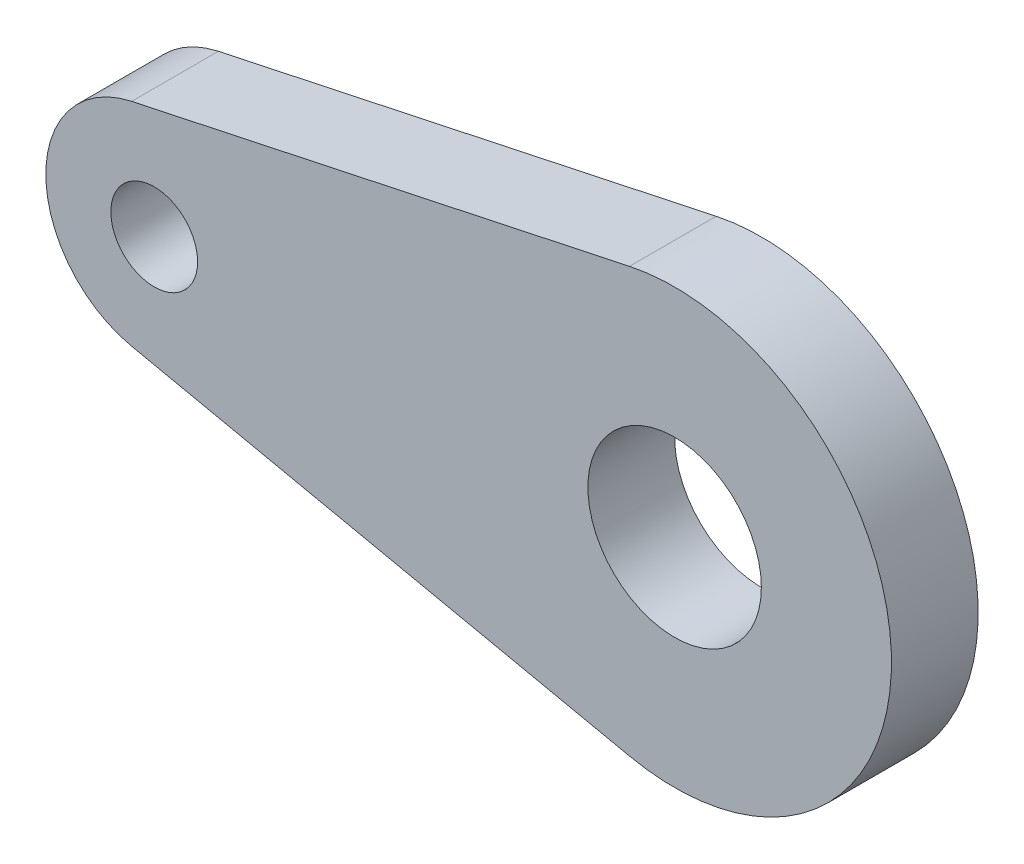
ISO-10303-21;
HEADER;
FILE_DESCRIPTION(('STEP AP214'),'2;1');
FILE_NAME('part.step','',(''),(''),'','','');
FILE_SCHEMA(('AUTOMOTIVE_DESIGN { 1 0 10303 214 1 1 1 1 }'));
ENDSEC;
DATA;
#1=APPLICATION_CONTEXT('core data for automotive mechanical design processes');
#2=APPLICATION_PROTOCOL_DEFINITION('international standard','automotive_design',2000,#1);
#3=PRODUCT_CONTEXT('',#1,'mechanical');
#4=PRODUCT('Part','Part','',(#3));
#5=PRODUCT_RELATED_PRODUCT_CATEGORY('part','',(#4));
#6=PRODUCT_DEFINITION_FORMATION('','',#4);
#7=PRODUCT_DEFINITION_CONTEXT('part definition',#1,'design');
#8=PRODUCT_DEFINITION('design','',#6,#7);
#9=PRODUCT_DEFINITION_SHAPE('','',#8);
#10=(LENGTH_UNIT() NAMED_UNIT(*) SI_UNIT(.MILLI.,.METRE.));
#11=(NAMED_UNIT(*) PLANE_ANGLE_UNIT() SI_UNIT($,.RADIAN.));
#12=(NAMED_UNIT(*) SI_UNIT($,.STERADIAN.) SOLID_ANGLE_UNIT());
#13=UNCERTAINTY_MEASURE_WITH_UNIT(LENGTH_MEASURE(1.E-05),#10,'distance_accuracy_value','');
#14=(GEOMETRIC_REPRESENTATION_CONTEXT(3) GLOBAL_UNCERTAINTY_ASSIGNED_CONTEXT((#13)) GLOBAL_UNIT_ASSIGNED_CONTEXT((#10,
#11,#12)) REPRESENTATION_CONTEXT('',''));
#15=CARTESIAN_POINT('',(0.,0.,0.));
#16=DIRECTION('',(0.,0.,1.));
#17=DIRECTION('',(1.,0.,0.));
#18=AXIS2_PLACEMENT_3D('',#15,#16,#17);
#19=CARTESIAN_POINT('',(-76.2,0.,12.7));
#20=DIRECTION('',(0.,0.,1.));
#21=DIRECTION('',(1.,0.,0.));
#22=AXIS2_PLACEMENT_3D('',#19,#20,#21);
#23=PLANE('',#22);
#24=CARTESIAN_POINT('',(-76.2,0.,12.7));
#25=DIRECTION('',(0.,0.,1.));
#26=DIRECTION('',(1.,0.,0.));
#27=AXIS2_PLACEMENT_3D('',#24,#25,#26);
#28=CIRCLE('',#27,6.35);
#29=CARTESIAN_POINT('',(-69.85,0.,12.7));
#30=VERTEX_POINT('',#29);
#31=EDGE_CURVE('E116',#30,#30,#28,.T.);
#32=ORIENTED_EDGE('',*,*,#31,.F.);
#33=EDGE_LOOP('',(#32));
#34=FACE_BOUND('',#33,.T.);
#35=CARTESIAN_POINT('',(-76.2,0.,12.7));
#36=DIRECTION('',(0.,0.,1.));
#37=DIRECTION('',(1.,0.,0.));
#38=AXIS2_PLACEMENT_3D('',#35,#36,#37);
#39=CIRCLE('',#38,15.875);
#40=CARTESIAN_POINT('',(-79.5072916666667,15.5266688903833,12.7));
#41=VERTEX_POINT('',#40);
#42=CARTESIAN_POINT('',(-79.5072916666667,-15.5266688903833,12.7));
#43=VERTEX_POINT('',#42);
#44=EDGE_CURVE('E96',#41,#43,#39,.T.);
#45=ORIENTED_EDGE('',*,*,#44,.T.);
#46=DIRECTION('',(0.978057882858792,-0.208333333333333,0.));
#47=VECTOR('',#46,1.);
#48=CARTESIAN_POINT('',(-79.5072916666667,-15.5266688903833,12.7));
#49=LINE('',#48,#47);
#50=CARTESIAN_POINT('',(-6.61458333333333,-31.0533377807666,12.7));
#51=VERTEX_POINT('',#50);
#52=EDGE_CURVE('E91',#43,#51,#49,.T.);
#53=ORIENTED_EDGE('',*,*,#52,.T.);
#54=CARTESIAN_POINT('',(0.,0.,12.7));
#55=DIRECTION('',(0.,0.,1.));
#56=DIRECTION('',(1.,0.,0.));
#57=AXIS2_PLACEMENT_3D('',#54,#55,#56);
#58=CIRCLE('',#57,31.75);
#59=CARTESIAN_POINT('',(-6.61458333333331,31.0533377807666,12.7));
#60=VERTEX_POINT('',#59);
#61=EDGE_CURVE('E94',#51,#60,#58,.T.);
#62=ORIENTED_EDGE('',*,*,#61,.T.);
#63=DIRECTION('',(-0.978057882858792,-0.208333333333333,0.));
#64=VECTOR('',#63,1.);
#65=CARTESIAN_POINT('',(-79.5072916666667,15.5266688903833,12.7));
#66=LINE('',#65,#64);
#67=EDGE_CURVE('E61',#60,#41,#66,.T.);
#68=ORIENTED_EDGE('',*,*,#67,.T.);
#69=EDGE_LOOP('',(#45,#53,#62,#68));
#70=FACE_BOUND('',#69,.T.);
#71=CARTESIAN_POINT('',(0.,0.,12.7));
#72=DIRECTION('',(0.,0.,1.));
#73=DIRECTION('',(1.,0.,0.));
#74=AXIS2_PLACEMENT_3D('',#71,#72,#73);
#75=CIRCLE('',#74,12.7);
#76=CARTESIAN_POINT('',(12.7,0.,12.7));
#77=VERTEX_POINT('',#76);
#78=EDGE_CURVE('E138',#77,#77,#75,.T.);
#79=ORIENTED_EDGE('',*,*,#78,.F.);
#80=EDGE_LOOP('',(#79));
#81=FACE_BOUND('',#80,.T.);
#82=ADVANCED_FACE('F43',(#34,#70,#81),#23,.T.);
#83=CARTESIAN_POINT('',(-76.2,0.,0.));
#84=DIRECTION('',(0.,0.,1.));
#85=DIRECTION('',(1.,0.,0.));
#86=AXIS2_PLACEMENT_3D('',#83,#84,#85);
#87=PLANE('',#86);
#88=CARTESIAN_POINT('',(-76.2,0.,0.));
#89=DIRECTION('',(0.,0.,1.));
#90=DIRECTION('',(1.,0.,0.));
#91=AXIS2_PLACEMENT_3D('',#88,#89,#90);
#92=CIRCLE('',#91,15.875);
#93=CARTESIAN_POINT('',(-79.5072916666667,15.5266688903833,0.));
#94=VERTEX_POINT('',#93);
#95=CARTESIAN_POINT('',(-79.5072916666667,-15.5266688903833,0.));
#96=VERTEX_POINT('',#95);
#97=EDGE_CURVE('E112',#94,#96,#92,.T.);
#98=ORIENTED_EDGE('',*,*,#97,.F.);
#99=DIRECTION('',(-0.978057882858792,-0.208333333333333,0.));
#100=VECTOR('',#99,1.);
#101=CARTESIAN_POINT('',(-79.5072916666667,15.5266688903833,0.));
#102=LINE('',#101,#100);
#103=CARTESIAN_POINT('',(-6.61458333333331,31.0533377807666,0.));
#104=VERTEX_POINT('',#103);
#105=EDGE_CURVE('E84',#104,#94,#102,.T.);
#106=ORIENTED_EDGE('',*,*,#105,.F.);
#107=CARTESIAN_POINT('',(0.,0.,0.));
#108=DIRECTION('',(0.,0.,1.));
#109=DIRECTION('',(1.,0.,0.));
#110=AXIS2_PLACEMENT_3D('',#107,#108,#109);
#111=CIRCLE('',#110,31.75);
#112=CARTESIAN_POINT('',(-6.61458333333333,-31.0533377807666,0.));
#113=VERTEX_POINT('',#112);
#114=EDGE_CURVE('E78',#113,#104,#111,.T.);
#115=ORIENTED_EDGE('',*,*,#114,.F.);
#116=DIRECTION('',(0.978057882858792,-0.208333333333333,0.));
#117=VECTOR('',#116,1.);
#118=CARTESIAN_POINT('',(-79.5072916666667,-15.5266688903833,0.));
#119=LINE('',#118,#117);
#120=EDGE_CURVE('E101',#96,#113,#119,.T.);
#121=ORIENTED_EDGE('',*,*,#120,.F.);
#122=EDGE_LOOP('',(#98,#106,#115,#121));
#123=FACE_BOUND('',#122,.T.);
#124=CARTESIAN_POINT('',(-76.2,0.,0.));
#125=DIRECTION('',(0.,0.,1.));
#126=DIRECTION('',(1.,0.,0.));
#127=AXIS2_PLACEMENT_3D('',#124,#125,#126);
#128=CIRCLE('',#127,6.35);
#129=CARTESIAN_POINT('',(-69.85,0.,0.));
#130=VERTEX_POINT('',#129);
#131=EDGE_CURVE('E134',#130,#130,#128,.T.);
#132=ORIENTED_EDGE('',*,*,#131,.T.);
#133=EDGE_LOOP('',(#132));
#134=FACE_BOUND('',#133,.T.);
#135=CARTESIAN_POINT('',(0.,0.,0.));
#136=DIRECTION('',(0.,0.,1.));
#137=DIRECTION('',(1.,0.,0.));
#138=AXIS2_PLACEMENT_3D('',#135,#136,#137);
#139=CIRCLE('',#138,12.7);
#140=CARTESIAN_POINT('',(12.7,0.,0.));
#141=VERTEX_POINT('',#140);
#142=EDGE_CURVE('E142',#141,#141,#139,.T.);
#143=ORIENTED_EDGE('',*,*,#142,.T.);
#144=EDGE_LOOP('',(#143));
#145=FACE_BOUND('',#144,.T.);
#146=ADVANCED_FACE('F129',(#123,#134,#145),#87,.F.);
#147=CARTESIAN_POINT('',(-76.2,0.,12.7));
#148=DIRECTION('',(0.,0.,-1.));
#149=DIRECTION('',(-1.,0.,0.));
#150=AXIS2_PLACEMENT_3D('',#147,#148,#149);
#151=CYLINDRICAL_SURFACE('',#150,15.875);
#152=ORIENTED_EDGE('',*,*,#97,.T.);
#153=DIRECTION('',(0.,0.,-1.));
#154=VECTOR('',#153,1.);
#155=CARTESIAN_POINT('',(-79.5072916666667,-15.5266688903833,12.7));
#156=LINE('',#155,#154);
#157=EDGE_CURVE('E11',#43,#96,#156,.T.);
#158=ORIENTED_EDGE('',*,*,#157,.F.);
#159=ORIENTED_EDGE('',*,*,#44,.F.);
#160=DIRECTION('',(0.,0.,-1.));
#161=VECTOR('',#160,1.);
#162=CARTESIAN_POINT('',(-79.5072916666667,15.5266688903833,12.7));
#163=LINE('',#162,#161);
#164=EDGE_CURVE('E108',#41,#94,#163,.T.);
#165=ORIENTED_EDGE('',*,*,#164,.T.);
#166=EDGE_LOOP('',(#152,#158,#159,#165));
#167=FACE_BOUND('',#166,.T.);
#168=ADVANCED_FACE('F45',(#167),#151,.T.);
#169=CARTESIAN_POINT('',(-79.5072916666667,-15.5266688903833,12.7));
#170=DIRECTION('',(0.208333333333333,0.978057882858792,0.));
#171=DIRECTION('',(-0.978057882858792,0.208333333333333,0.));
#172=AXIS2_PLACEMENT_3D('',#169,#170,#171);
#173=PLANE('',#172);
#174=ORIENTED_EDGE('',*,*,#120,.T.);
#175=DIRECTION('',(0.,0.,-1.));
#176=VECTOR('',#175,1.);
#177=CARTESIAN_POINT('',(-6.61458333333333,-31.0533377807666,12.7));
#178=LINE('',#177,#176);
#179=EDGE_CURVE('E53',#51,#113,#178,.T.);
#180=ORIENTED_EDGE('',*,*,#179,.F.);
#181=ORIENTED_EDGE('',*,*,#52,.F.);
#182=ORIENTED_EDGE('',*,*,#157,.T.);
#183=EDGE_LOOP('',(#174,#180,#181,#182));
#184=FACE_BOUND('',#183,.T.);
#185=ADVANCED_FACE('F100',(#184),#173,.F.);
#186=CARTESIAN_POINT('',(0.,0.,12.7));
#187=DIRECTION('',(0.,0.,-1.));
#188=DIRECTION('',(-1.,0.,0.));
#189=AXIS2_PLACEMENT_3D('',#186,#187,#188);
#190=CYLINDRICAL_SURFACE('',#189,31.75);
#191=ORIENTED_EDGE('',*,*,#114,.T.);
#192=DIRECTION('',(0.,0.,-1.));
#193=VECTOR('',#192,1.);
#194=CARTESIAN_POINT('',(-6.61458333333331,31.0533377807666,12.7));
#195=LINE('',#194,#193);
#196=EDGE_CURVE('E103',#60,#104,#195,.T.);
#197=ORIENTED_EDGE('',*,*,#196,.F.);
#198=ORIENTED_EDGE('',*,*,#61,.F.);
#199=ORIENTED_EDGE('',*,*,#179,.T.);
#200=EDGE_LOOP('',(#191,#197,#198,#199));
#201=FACE_BOUND('',#200,.T.);
#202=ADVANCED_FACE('F104',(#201),#190,.T.);
#203=CARTESIAN_POINT('',(-79.5072916666667,15.5266688903833,12.7));
#204=DIRECTION('',(0.208333333333333,-0.978057882858792,0.));
#205=DIRECTION('',(0.978057882858792,0.208333333333333,0.));
#206=AXIS2_PLACEMENT_3D('',#203,#204,#205);
#207=PLANE('',#206);
#208=ORIENTED_EDGE('',*,*,#105,.T.);
#209=ORIENTED_EDGE('',*,*,#164,.F.);
#210=ORIENTED_EDGE('',*,*,#67,.F.);
#211=ORIENTED_EDGE('',*,*,#196,.T.);
#212=EDGE_LOOP('',(#208,#209,#210,#211));
#213=FACE_BOUND('',#212,.T.);
#214=ADVANCED_FACE('F126',(#213),#207,.F.);
#215=CARTESIAN_POINT('',(-76.2,0.,12.7));
#216=DIRECTION('',(0.,0.,-1.));
#217=DIRECTION('',(-1.,0.,0.));
#218=AXIS2_PLACEMENT_3D('',#215,#216,#217);
#219=CYLINDRICAL_SURFACE('',#218,6.35);
#220=ORIENTED_EDGE('',*,*,#31,.T.);
#221=EDGE_LOOP('',(#220));
#222=FACE_BOUND('',#221,.T.);
#223=ORIENTED_EDGE('',*,*,#131,.F.);
#224=EDGE_LOOP('',(#223));
#225=FACE_BOUND('',#224,.T.);
#226=ADVANCED_FACE('F161',(#222,#225),#219,.F.);
#227=CARTESIAN_POINT('',(0.,0.,12.7));
#228=DIRECTION('',(0.,0.,-1.));
#229=DIRECTION('',(-1.,0.,0.));
#230=AXIS2_PLACEMENT_3D('',#227,#228,#229);
#231=CYLINDRICAL_SURFACE('',#230,12.7);
#232=ORIENTED_EDGE('',*,*,#78,.T.);
#233=EDGE_LOOP('',(#232));
#234=FACE_BOUND('',#233,.T.);
#235=ORIENTED_EDGE('',*,*,#142,.F.);
#236=EDGE_LOOP('',(#235));
#237=FACE_BOUND('',#236,.T.);
#238=ADVANCED_FACE('F150',(#234,#237),#231,.F.);
#239=CLOSED_SHELL('',(#82,#146,#168,#185,#202,#214,#226,#238));
#240=MANIFOLD_SOLID_BREP('B2',#239);
#241=ADVANCED_BREP_SHAPE_REPRESENTATION('',(#18,#240),#14);
#242=SHAPE_DEFINITION_REPRESENTATION(#9,#241);
ENDSEC;
END-ISO-10303-21;
